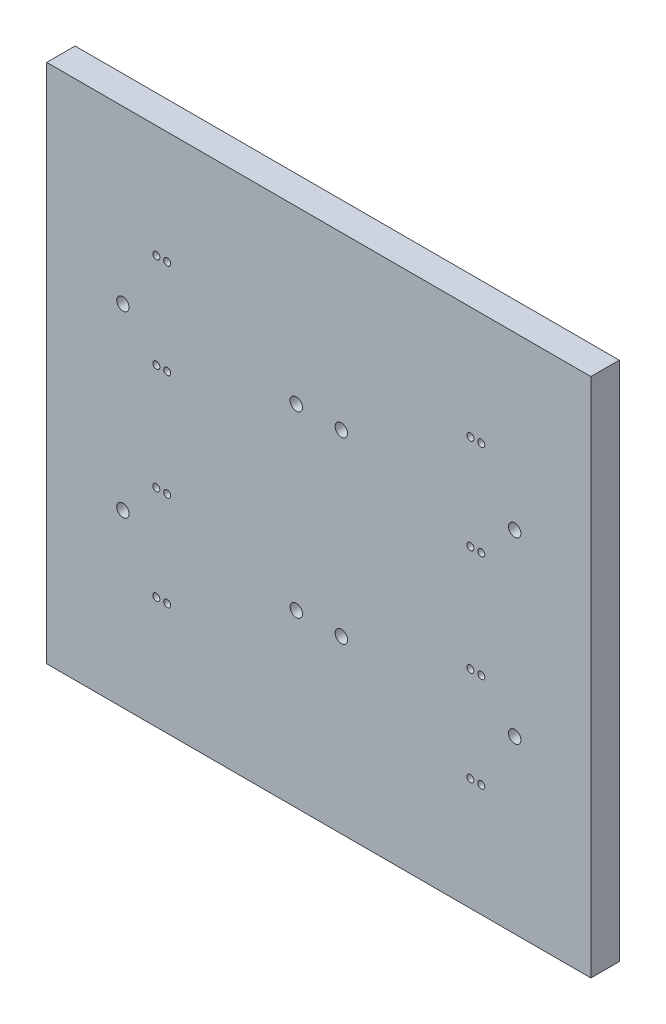
ISO-10303-21;
HEADER;
FILE_DESCRIPTION(('STEP AP214'),'2;1');
FILE_NAME('part.step','',(''),(''),'','','');
FILE_SCHEMA(('AUTOMOTIVE_DESIGN { 1 0 10303 214 1 1 1 1 }'));
ENDSEC;
DATA;
#1=APPLICATION_CONTEXT('core data for automotive mechanical design processes');
#2=APPLICATION_PROTOCOL_DEFINITION('international standard','automotive_design',2000,#1);
#3=PRODUCT_CONTEXT('',#1,'mechanical');
#4=PRODUCT('Part','Part','',(#3));
#5=PRODUCT_RELATED_PRODUCT_CATEGORY('part','',(#4));
#6=PRODUCT_DEFINITION_FORMATION('','',#4);
#7=PRODUCT_DEFINITION_CONTEXT('part definition',#1,'design');
#8=PRODUCT_DEFINITION('design','',#6,#7);
#9=PRODUCT_DEFINITION_SHAPE('','',#8);
#10=(LENGTH_UNIT() NAMED_UNIT(*) SI_UNIT(.MILLI.,.METRE.));
#11=(NAMED_UNIT(*) PLANE_ANGLE_UNIT() SI_UNIT($,.RADIAN.));
#12=(NAMED_UNIT(*) SI_UNIT($,.STERADIAN.) SOLID_ANGLE_UNIT());
#13=UNCERTAINTY_MEASURE_WITH_UNIT(LENGTH_MEASURE(1.E-05),#10,'distance_accuracy_value','');
#14=(GEOMETRIC_REPRESENTATION_CONTEXT(3) GLOBAL_UNCERTAINTY_ASSIGNED_CONTEXT((#13)) GLOBAL_UNIT_ASSIGNED_CONTEXT((#10,
#11,#12)) REPRESENTATION_CONTEXT('',''));
#15=CARTESIAN_POINT('',(0.,0.,0.));
#16=DIRECTION('',(0.,0.,1.));
#17=DIRECTION('',(1.,0.,0.));
#18=AXIS2_PLACEMENT_3D('',#15,#16,#17);
#19=CARTESIAN_POINT('',(70.5,-133.36,18.25));
#20=DIRECTION('',(0.,0.,-1.));
#21=DIRECTION('',(-1.,0.,0.));
#22=AXIS2_PLACEMENT_3D('',#19,#20,#21);
#23=CYLINDRICAL_SURFACE('',#22,2.25);
#24=CARTESIAN_POINT('',(70.5,-133.36,18.25));
#25=DIRECTION('',(0.,0.,-1.));
#26=DIRECTION('',(1.,0.,0.));
#27=AXIS2_PLACEMENT_3D('',#24,#25,#26);
#28=CIRCLE('',#27,2.25);
#29=CARTESIAN_POINT('',(72.75,-133.36,18.25));
#30=VERTEX_POINT('',#29);
#31=EDGE_CURVE('E40',#30,#30,#28,.T.);
#32=ORIENTED_EDGE('',*,*,#31,.F.);
#33=EDGE_LOOP('',(#32));
#34=FACE_BOUND('',#33,.T.);
#35=CARTESIAN_POINT('',(70.5,-133.36,0.));
#36=DIRECTION('',(0.,0.,-1.));
#37=DIRECTION('',(1.,0.,0.));
#38=AXIS2_PLACEMENT_3D('',#35,#36,#37);
#39=CIRCLE('',#38,2.25);
#40=CARTESIAN_POINT('',(72.75,-133.36,0.));
#41=VERTEX_POINT('',#40);
#42=EDGE_CURVE('E11',#41,#41,#39,.T.);
#43=ORIENTED_EDGE('',*,*,#42,.T.);
#44=EDGE_LOOP('',(#43));
#45=FACE_BOUND('',#44,.T.);
#46=ADVANCED_FACE('F32',(#34,#45),#23,.F.);
#47=CARTESIAN_POINT('',(77.5,-133.36,18.25));
#48=DIRECTION('',(0.,0.,-1.));
#49=DIRECTION('',(-1.,0.,0.));
#50=AXIS2_PLACEMENT_3D('',#47,#48,#49);
#51=CYLINDRICAL_SURFACE('',#50,2.25);
#52=CARTESIAN_POINT('',(77.5,-133.36,18.25));
#53=DIRECTION('',(0.,0.,-1.));
#54=DIRECTION('',(1.,0.,0.));
#55=AXIS2_PLACEMENT_3D('',#52,#53,#54);
#56=CIRCLE('',#55,2.25);
#57=CARTESIAN_POINT('',(79.75,-133.36,18.25));
#58=VERTEX_POINT('',#57);
#59=EDGE_CURVE('E206',#58,#58,#56,.T.);
#60=ORIENTED_EDGE('',*,*,#59,.F.);
#61=EDGE_LOOP('',(#60));
#62=FACE_BOUND('',#61,.T.);
#63=CARTESIAN_POINT('',(77.5,-133.36,0.));
#64=DIRECTION('',(0.,0.,-1.));
#65=DIRECTION('',(1.,0.,0.));
#66=AXIS2_PLACEMENT_3D('',#63,#64,#65);
#67=CIRCLE('',#66,2.25);
#68=CARTESIAN_POINT('',(79.75,-133.36,0.));
#69=VERTEX_POINT('',#68);
#70=EDGE_CURVE('E209',#69,#69,#67,.T.);
#71=ORIENTED_EDGE('',*,*,#70,.T.);
#72=EDGE_LOOP('',(#71));
#73=FACE_BOUND('',#72,.T.);
#74=ADVANCED_FACE('F218',(#62,#73),#51,.F.);
#75=CARTESIAN_POINT('',(70.5,-72.36,18.25));
#76=DIRECTION('',(0.,0.,-1.));
#77=DIRECTION('',(-1.,0.,0.));
#78=AXIS2_PLACEMENT_3D('',#75,#76,#77);
#79=CYLINDRICAL_SURFACE('',#78,2.25);
#80=CARTESIAN_POINT('',(70.5,-72.36,18.25));
#81=DIRECTION('',(0.,0.,-1.));
#82=DIRECTION('',(1.,0.,0.));
#83=AXIS2_PLACEMENT_3D('',#80,#81,#82);
#84=CIRCLE('',#83,2.25);
#85=CARTESIAN_POINT('',(72.75,-72.36,18.25));
#86=VERTEX_POINT('',#85);
#87=EDGE_CURVE('E200',#86,#86,#84,.T.);
#88=ORIENTED_EDGE('',*,*,#87,.F.);
#89=EDGE_LOOP('',(#88));
#90=FACE_BOUND('',#89,.T.);
#91=CARTESIAN_POINT('',(70.5,-72.36,0.));
#92=DIRECTION('',(0.,0.,-1.));
#93=DIRECTION('',(1.,0.,0.));
#94=AXIS2_PLACEMENT_3D('',#91,#92,#93);
#95=CIRCLE('',#94,2.25);
#96=CARTESIAN_POINT('',(72.75,-72.36,0.));
#97=VERTEX_POINT('',#96);
#98=EDGE_CURVE('E203',#97,#97,#95,.T.);
#99=ORIENTED_EDGE('',*,*,#98,.T.);
#100=EDGE_LOOP('',(#99));
#101=FACE_BOUND('',#100,.T.);
#102=ADVANCED_FACE('F388',(#90,#101),#79,.F.);
#103=CARTESIAN_POINT('',(77.5,-72.36,18.25));
#104=DIRECTION('',(0.,0.,-1.));
#105=DIRECTION('',(-1.,0.,0.));
#106=AXIS2_PLACEMENT_3D('',#103,#104,#105);
#107=CYLINDRICAL_SURFACE('',#106,2.25);
#108=CARTESIAN_POINT('',(77.5,-72.36,18.25));
#109=DIRECTION('',(0.,0.,-1.));
#110=DIRECTION('',(1.,0.,0.));
#111=AXIS2_PLACEMENT_3D('',#108,#109,#110);
#112=CIRCLE('',#111,2.25);
#113=CARTESIAN_POINT('',(79.75,-72.36,18.25));
#114=VERTEX_POINT('',#113);
#115=EDGE_CURVE('E194',#114,#114,#112,.T.);
#116=ORIENTED_EDGE('',*,*,#115,.F.);
#117=EDGE_LOOP('',(#116));
#118=FACE_BOUND('',#117,.T.);
#119=CARTESIAN_POINT('',(77.5,-72.36,0.));
#120=DIRECTION('',(0.,0.,-1.));
#121=DIRECTION('',(1.,0.,0.));
#122=AXIS2_PLACEMENT_3D('',#119,#120,#121);
#123=CIRCLE('',#122,2.25);
#124=CARTESIAN_POINT('',(79.75,-72.36,0.));
#125=VERTEX_POINT('',#124);
#126=EDGE_CURVE('E197',#125,#125,#123,.T.);
#127=ORIENTED_EDGE('',*,*,#126,.T.);
#128=EDGE_LOOP('',(#127));
#129=FACE_BOUND('',#128,.T.);
#130=ADVANCED_FACE('F384',(#118,#129),#107,.F.);
#131=CARTESIAN_POINT('',(272.5,-133.36,18.25));
#132=DIRECTION('',(0.,0.,-1.));
#133=DIRECTION('',(1.,0.,0.));
#134=AXIS2_PLACEMENT_3D('',#131,#132,#133);
#135=CYLINDRICAL_SURFACE('',#134,2.25);
#136=CARTESIAN_POINT('',(272.5,-133.36,18.25));
#137=DIRECTION('',(0.,0.,1.));
#138=DIRECTION('',(-1.,0.,0.));
#139=AXIS2_PLACEMENT_3D('',#136,#137,#138);
#140=CIRCLE('',#139,2.25);
#141=CARTESIAN_POINT('',(270.25,-133.36,18.25));
#142=VERTEX_POINT('',#141);
#143=EDGE_CURVE('E188',#142,#142,#140,.T.);
#144=ORIENTED_EDGE('',*,*,#143,.T.);
#145=EDGE_LOOP('',(#144));
#146=FACE_BOUND('',#145,.T.);
#147=CARTESIAN_POINT('',(272.5,-133.36,0.));
#148=DIRECTION('',(0.,0.,1.));
#149=DIRECTION('',(-1.,0.,0.));
#150=AXIS2_PLACEMENT_3D('',#147,#148,#149);
#151=CIRCLE('',#150,2.25);
#152=CARTESIAN_POINT('',(270.25,-133.36,0.));
#153=VERTEX_POINT('',#152);
#154=EDGE_CURVE('E191',#153,#153,#151,.T.);
#155=ORIENTED_EDGE('',*,*,#154,.F.);
#156=EDGE_LOOP('',(#155));
#157=FACE_BOUND('',#156,.T.);
#158=ADVANCED_FACE('F380',(#146,#157),#135,.F.);
#159=CARTESIAN_POINT('',(279.5,-133.36,18.25));
#160=DIRECTION('',(0.,0.,-1.));
#161=DIRECTION('',(1.,0.,0.));
#162=AXIS2_PLACEMENT_3D('',#159,#160,#161);
#163=CYLINDRICAL_SURFACE('',#162,2.25);
#164=CARTESIAN_POINT('',(279.5,-133.36,18.25));
#165=DIRECTION('',(0.,0.,1.));
#166=DIRECTION('',(-1.,0.,0.));
#167=AXIS2_PLACEMENT_3D('',#164,#165,#166);
#168=CIRCLE('',#167,2.25);
#169=CARTESIAN_POINT('',(277.25,-133.36,18.25));
#170=VERTEX_POINT('',#169);
#171=EDGE_CURVE('E182',#170,#170,#168,.T.);
#172=ORIENTED_EDGE('',*,*,#171,.T.);
#173=EDGE_LOOP('',(#172));
#174=FACE_BOUND('',#173,.T.);
#175=CARTESIAN_POINT('',(279.5,-133.36,0.));
#176=DIRECTION('',(0.,0.,1.));
#177=DIRECTION('',(-1.,0.,0.));
#178=AXIS2_PLACEMENT_3D('',#175,#176,#177);
#179=CIRCLE('',#178,2.25);
#180=CARTESIAN_POINT('',(277.25,-133.36,0.));
#181=VERTEX_POINT('',#180);
#182=EDGE_CURVE('E185',#181,#181,#179,.T.);
#183=ORIENTED_EDGE('',*,*,#182,.F.);
#184=EDGE_LOOP('',(#183));
#185=FACE_BOUND('',#184,.T.);
#186=ADVANCED_FACE('F376',(#174,#185),#163,.F.);
#187=CARTESIAN_POINT('',(272.5,-72.36,18.25));
#188=DIRECTION('',(0.,0.,-1.));
#189=DIRECTION('',(1.,0.,0.));
#190=AXIS2_PLACEMENT_3D('',#187,#188,#189);
#191=CYLINDRICAL_SURFACE('',#190,2.25);
#192=CARTESIAN_POINT('',(272.5,-72.36,18.25));
#193=DIRECTION('',(0.,0.,1.));
#194=DIRECTION('',(-1.,0.,0.));
#195=AXIS2_PLACEMENT_3D('',#192,#193,#194);
#196=CIRCLE('',#195,2.25);
#197=CARTESIAN_POINT('',(270.25,-72.36,18.25));
#198=VERTEX_POINT('',#197);
#199=EDGE_CURVE('E176',#198,#198,#196,.T.);
#200=ORIENTED_EDGE('',*,*,#199,.T.);
#201=EDGE_LOOP('',(#200));
#202=FACE_BOUND('',#201,.T.);
#203=CARTESIAN_POINT('',(272.5,-72.36,0.));
#204=DIRECTION('',(0.,0.,1.));
#205=DIRECTION('',(-1.,0.,0.));
#206=AXIS2_PLACEMENT_3D('',#203,#204,#205);
#207=CIRCLE('',#206,2.25);
#208=CARTESIAN_POINT('',(270.25,-72.36,0.));
#209=VERTEX_POINT('',#208);
#210=EDGE_CURVE('E179',#209,#209,#207,.T.);
#211=ORIENTED_EDGE('',*,*,#210,.F.);
#212=EDGE_LOOP('',(#211));
#213=FACE_BOUND('',#212,.T.);
#214=ADVANCED_FACE('F372',(#202,#213),#191,.F.);
#215=CARTESIAN_POINT('',(279.5,-72.36,18.25));
#216=DIRECTION('',(0.,0.,-1.));
#217=DIRECTION('',(1.,0.,0.));
#218=AXIS2_PLACEMENT_3D('',#215,#216,#217);
#219=CYLINDRICAL_SURFACE('',#218,2.25);
#220=CARTESIAN_POINT('',(279.5,-72.36,18.25));
#221=DIRECTION('',(0.,0.,1.));
#222=DIRECTION('',(-1.,0.,0.));
#223=AXIS2_PLACEMENT_3D('',#220,#221,#222);
#224=CIRCLE('',#223,2.25);
#225=CARTESIAN_POINT('',(277.25,-72.36,18.25));
#226=VERTEX_POINT('',#225);
#227=EDGE_CURVE('E170',#226,#226,#224,.T.);
#228=ORIENTED_EDGE('',*,*,#227,.T.);
#229=EDGE_LOOP('',(#228));
#230=FACE_BOUND('',#229,.T.);
#231=CARTESIAN_POINT('',(279.5,-72.36,0.));
#232=DIRECTION('',(0.,0.,1.));
#233=DIRECTION('',(-1.,0.,0.));
#234=AXIS2_PLACEMENT_3D('',#231,#232,#233);
#235=CIRCLE('',#234,2.25);
#236=CARTESIAN_POINT('',(277.25,-72.36,0.));
#237=VERTEX_POINT('',#236);
#238=EDGE_CURVE('E173',#237,#237,#235,.T.);
#239=ORIENTED_EDGE('',*,*,#238,.F.);
#240=EDGE_LOOP('',(#239));
#241=FACE_BOUND('',#240,.T.);
#242=ADVANCED_FACE('F368',(#230,#241),#219,.F.);
#243=CARTESIAN_POINT('',(49.,-110.,18.25));
#244=DIRECTION('',(0.,0.,-1.));
#245=DIRECTION('',(-1.,0.,0.));
#246=AXIS2_PLACEMENT_3D('',#243,#244,#245);
#247=CYLINDRICAL_SURFACE('',#246,4.00000000000001);
#248=CARTESIAN_POINT('',(49.,-110.,18.25));
#249=DIRECTION('',(0.,0.,-1.));
#250=DIRECTION('',(1.,0.,0.));
#251=AXIS2_PLACEMENT_3D('',#248,#249,#250);
#252=CIRCLE('',#251,4.00000000000001);
#253=CARTESIAN_POINT('',(53.,-110.,18.25));
#254=VERTEX_POINT('',#253);
#255=EDGE_CURVE('E164',#254,#254,#252,.T.);
#256=ORIENTED_EDGE('',*,*,#255,.F.);
#257=EDGE_LOOP('',(#256));
#258=FACE_BOUND('',#257,.T.);
#259=CARTESIAN_POINT('',(49.,-110.,0.));
#260=DIRECTION('',(0.,0.,-1.));
#261=DIRECTION('',(1.,0.,0.));
#262=AXIS2_PLACEMENT_3D('',#259,#260,#261);
#263=CIRCLE('',#262,4.00000000000001);
#264=CARTESIAN_POINT('',(53.,-110.,0.));
#265=VERTEX_POINT('',#264);
#266=EDGE_CURVE('E167',#265,#265,#263,.T.);
#267=ORIENTED_EDGE('',*,*,#266,.T.);
#268=EDGE_LOOP('',(#267));
#269=FACE_BOUND('',#268,.T.);
#270=ADVANCED_FACE('F364',(#258,#269),#247,.F.);
#271=CARTESIAN_POINT('',(301.,-110.,18.25));
#272=DIRECTION('',(0.,0.,-1.));
#273=DIRECTION('',(1.,0.,0.));
#274=AXIS2_PLACEMENT_3D('',#271,#272,#273);
#275=CYLINDRICAL_SURFACE('',#274,4.00000000000001);
#276=CARTESIAN_POINT('',(301.,-110.,18.25));
#277=DIRECTION('',(0.,0.,1.));
#278=DIRECTION('',(-1.,0.,0.));
#279=AXIS2_PLACEMENT_3D('',#276,#277,#278);
#280=CIRCLE('',#279,4.00000000000001);
#281=CARTESIAN_POINT('',(297.,-110.,18.25));
#282=VERTEX_POINT('',#281);
#283=EDGE_CURVE('E158',#282,#282,#280,.T.);
#284=ORIENTED_EDGE('',*,*,#283,.T.);
#285=EDGE_LOOP('',(#284));
#286=FACE_BOUND('',#285,.T.);
#287=CARTESIAN_POINT('',(301.,-110.,0.));
#288=DIRECTION('',(0.,0.,1.));
#289=DIRECTION('',(-1.,0.,0.));
#290=AXIS2_PLACEMENT_3D('',#287,#288,#289);
#291=CIRCLE('',#290,4.00000000000001);
#292=CARTESIAN_POINT('',(297.,-110.,0.));
#293=VERTEX_POINT('',#292);
#294=EDGE_CURVE('E161',#293,#293,#291,.T.);
#295=ORIENTED_EDGE('',*,*,#294,.F.);
#296=EDGE_LOOP('',(#295));
#297=FACE_BOUND('',#296,.T.);
#298=ADVANCED_FACE('F360',(#286,#297),#275,.F.);
#299=CARTESIAN_POINT('',(189.5,-110.,18.25));
#300=DIRECTION('',(0.,0.,-1.));
#301=DIRECTION('',(1.,0.,0.));
#302=AXIS2_PLACEMENT_3D('',#299,#300,#301);
#303=CYLINDRICAL_SURFACE('',#302,3.99999999999999);
#304=CARTESIAN_POINT('',(189.5,-110.,18.25));
#305=DIRECTION('',(0.,0.,1.));
#306=DIRECTION('',(-1.,0.,0.));
#307=AXIS2_PLACEMENT_3D('',#304,#305,#306);
#308=CIRCLE('',#307,3.99999999999999);
#309=CARTESIAN_POINT('',(185.5,-110.,18.25));
#310=VERTEX_POINT('',#309);
#311=EDGE_CURVE('E152',#310,#310,#308,.T.);
#312=ORIENTED_EDGE('',*,*,#311,.T.);
#313=EDGE_LOOP('',(#312));
#314=FACE_BOUND('',#313,.T.);
#315=CARTESIAN_POINT('',(189.5,-110.,0.));
#316=DIRECTION('',(0.,0.,1.));
#317=DIRECTION('',(-1.,0.,0.));
#318=AXIS2_PLACEMENT_3D('',#315,#316,#317);
#319=CIRCLE('',#318,3.99999999999999);
#320=CARTESIAN_POINT('',(185.5,-110.,0.));
#321=VERTEX_POINT('',#320);
#322=EDGE_CURVE('E155',#321,#321,#319,.T.);
#323=ORIENTED_EDGE('',*,*,#322,.F.);
#324=EDGE_LOOP('',(#323));
#325=FACE_BOUND('',#324,.T.);
#326=ADVANCED_FACE('F356',(#314,#325),#303,.F.);
#327=CARTESIAN_POINT('',(160.5,-110.,18.25));
#328=DIRECTION('',(0.,0.,-1.));
#329=DIRECTION('',(-1.,0.,0.));
#330=AXIS2_PLACEMENT_3D('',#327,#328,#329);
#331=CYLINDRICAL_SURFACE('',#330,3.99999999999999);
#332=CARTESIAN_POINT('',(160.5,-110.,18.25));
#333=DIRECTION('',(0.,0.,-1.));
#334=DIRECTION('',(1.,0.,0.));
#335=AXIS2_PLACEMENT_3D('',#332,#333,#334);
#336=CIRCLE('',#335,3.99999999999999);
#337=CARTESIAN_POINT('',(164.5,-110.,18.25));
#338=VERTEX_POINT('',#337);
#339=EDGE_CURVE('E146',#338,#338,#336,.T.);
#340=ORIENTED_EDGE('',*,*,#339,.F.);
#341=EDGE_LOOP('',(#340));
#342=FACE_BOUND('',#341,.T.);
#343=CARTESIAN_POINT('',(160.5,-110.,0.));
#344=DIRECTION('',(0.,0.,-1.));
#345=DIRECTION('',(1.,0.,0.));
#346=AXIS2_PLACEMENT_3D('',#343,#344,#345);
#347=CIRCLE('',#346,3.99999999999999);
#348=CARTESIAN_POINT('',(164.5,-110.,0.));
#349=VERTEX_POINT('',#348);
#350=EDGE_CURVE('E149',#349,#349,#347,.T.);
#351=ORIENTED_EDGE('',*,*,#350,.T.);
#352=EDGE_LOOP('',(#351));
#353=FACE_BOUND('',#352,.T.);
#354=ADVANCED_FACE('F352',(#342,#353),#331,.F.);
#355=CARTESIAN_POINT('',(279.5,-201.64,18.25));
#356=DIRECTION('',(0.,0.,-1.));
#357=DIRECTION('',(1.,0.,0.));
#358=AXIS2_PLACEMENT_3D('',#355,#356,#357);
#359=CYLINDRICAL_SURFACE('',#358,2.25);
#360=CARTESIAN_POINT('',(279.5,-201.64,18.25));
#361=DIRECTION('',(0.,0.,-1.));
#362=DIRECTION('',(-1.,0.,0.));
#363=AXIS2_PLACEMENT_3D('',#360,#361,#362);
#364=CIRCLE('',#363,2.25);
#365=CARTESIAN_POINT('',(277.25,-201.64,18.25));
#366=VERTEX_POINT('',#365);
#367=EDGE_CURVE('E140',#366,#366,#364,.T.);
#368=ORIENTED_EDGE('',*,*,#367,.F.);
#369=EDGE_LOOP('',(#368));
#370=FACE_BOUND('',#369,.T.);
#371=CARTESIAN_POINT('',(279.5,-201.64,0.));
#372=DIRECTION('',(0.,0.,-1.));
#373=DIRECTION('',(-1.,0.,0.));
#374=AXIS2_PLACEMENT_3D('',#371,#372,#373);
#375=CIRCLE('',#374,2.25);
#376=CARTESIAN_POINT('',(277.25,-201.64,0.));
#377=VERTEX_POINT('',#376);
#378=EDGE_CURVE('E143',#377,#377,#375,.T.);
#379=ORIENTED_EDGE('',*,*,#378,.T.);
#380=EDGE_LOOP('',(#379));
#381=FACE_BOUND('',#380,.T.);
#382=ADVANCED_FACE('F348',(#370,#381),#359,.F.);
#383=CARTESIAN_POINT('',(272.5,-201.64,18.25));
#384=DIRECTION('',(0.,0.,-1.));
#385=DIRECTION('',(1.,0.,0.));
#386=AXIS2_PLACEMENT_3D('',#383,#384,#385);
#387=CYLINDRICAL_SURFACE('',#386,2.25);
#388=CARTESIAN_POINT('',(272.5,-201.64,18.25));
#389=DIRECTION('',(0.,0.,-1.));
#390=DIRECTION('',(-1.,0.,0.));
#391=AXIS2_PLACEMENT_3D('',#388,#389,#390);
#392=CIRCLE('',#391,2.25);
#393=CARTESIAN_POINT('',(270.25,-201.64,18.25));
#394=VERTEX_POINT('',#393);
#395=EDGE_CURVE('E134',#394,#394,#392,.T.);
#396=ORIENTED_EDGE('',*,*,#395,.F.);
#397=EDGE_LOOP('',(#396));
#398=FACE_BOUND('',#397,.T.);
#399=CARTESIAN_POINT('',(272.5,-201.64,0.));
#400=DIRECTION('',(0.,0.,-1.));
#401=DIRECTION('',(-1.,0.,0.));
#402=AXIS2_PLACEMENT_3D('',#399,#400,#401);
#403=CIRCLE('',#402,2.25);
#404=CARTESIAN_POINT('',(270.25,-201.64,0.));
#405=VERTEX_POINT('',#404);
#406=EDGE_CURVE('E137',#405,#405,#403,.T.);
#407=ORIENTED_EDGE('',*,*,#406,.T.);
#408=EDGE_LOOP('',(#407));
#409=FACE_BOUND('',#408,.T.);
#410=ADVANCED_FACE('F344',(#398,#409),#387,.F.);
#411=CARTESIAN_POINT('',(272.5,-262.64,18.25));
#412=DIRECTION('',(0.,0.,-1.));
#413=DIRECTION('',(1.,0.,0.));
#414=AXIS2_PLACEMENT_3D('',#411,#412,#413);
#415=CYLINDRICAL_SURFACE('',#414,2.25);
#416=CARTESIAN_POINT('',(272.5,-262.64,18.25));
#417=DIRECTION('',(0.,0.,-1.));
#418=DIRECTION('',(-1.,0.,0.));
#419=AXIS2_PLACEMENT_3D('',#416,#417,#418);
#420=CIRCLE('',#419,2.25);
#421=CARTESIAN_POINT('',(270.25,-262.64,18.25));
#422=VERTEX_POINT('',#421);
#423=EDGE_CURVE('E128',#422,#422,#420,.T.);
#424=ORIENTED_EDGE('',*,*,#423,.F.);
#425=EDGE_LOOP('',(#424));
#426=FACE_BOUND('',#425,.T.);
#427=CARTESIAN_POINT('',(272.5,-262.64,0.));
#428=DIRECTION('',(0.,0.,-1.));
#429=DIRECTION('',(-1.,0.,0.));
#430=AXIS2_PLACEMENT_3D('',#427,#428,#429);
#431=CIRCLE('',#430,2.25);
#432=CARTESIAN_POINT('',(270.25,-262.64,0.));
#433=VERTEX_POINT('',#432);
#434=EDGE_CURVE('E131',#433,#433,#431,.T.);
#435=ORIENTED_EDGE('',*,*,#434,.T.);
#436=EDGE_LOOP('',(#435));
#437=FACE_BOUND('',#436,.T.);
#438=ADVANCED_FACE('F340',(#426,#437),#415,.F.);
#439=CARTESIAN_POINT('',(279.5,-262.64,18.25));
#440=DIRECTION('',(0.,0.,-1.));
#441=DIRECTION('',(1.,0.,0.));
#442=AXIS2_PLACEMENT_3D('',#439,#440,#441);
#443=CYLINDRICAL_SURFACE('',#442,2.25);
#444=CARTESIAN_POINT('',(279.5,-262.64,18.25));
#445=DIRECTION('',(0.,0.,-1.));
#446=DIRECTION('',(-1.,0.,0.));
#447=AXIS2_PLACEMENT_3D('',#444,#445,#446);
#448=CIRCLE('',#447,2.25);
#449=CARTESIAN_POINT('',(277.25,-262.64,18.25));
#450=VERTEX_POINT('',#449);
#451=EDGE_CURVE('E122',#450,#450,#448,.T.);
#452=ORIENTED_EDGE('',*,*,#451,.F.);
#453=EDGE_LOOP('',(#452));
#454=FACE_BOUND('',#453,.T.);
#455=CARTESIAN_POINT('',(279.5,-262.64,0.));
#456=DIRECTION('',(0.,0.,-1.));
#457=DIRECTION('',(-1.,0.,0.));
#458=AXIS2_PLACEMENT_3D('',#455,#456,#457);
#459=CIRCLE('',#458,2.25);
#460=CARTESIAN_POINT('',(277.25,-262.64,0.));
#461=VERTEX_POINT('',#460);
#462=EDGE_CURVE('E125',#461,#461,#459,.T.);
#463=ORIENTED_EDGE('',*,*,#462,.T.);
#464=EDGE_LOOP('',(#463));
#465=FACE_BOUND('',#464,.T.);
#466=ADVANCED_FACE('F336',(#454,#465),#443,.F.);
#467=CARTESIAN_POINT('',(301.,-225.,18.25));
#468=DIRECTION('',(0.,0.,-1.));
#469=DIRECTION('',(1.,0.,0.));
#470=AXIS2_PLACEMENT_3D('',#467,#468,#469);
#471=CYLINDRICAL_SURFACE('',#470,4.00000000000001);
#472=CARTESIAN_POINT('',(301.,-225.,18.25));
#473=DIRECTION('',(0.,0.,-1.));
#474=DIRECTION('',(-1.,0.,0.));
#475=AXIS2_PLACEMENT_3D('',#472,#473,#474);
#476=CIRCLE('',#475,4.00000000000001);
#477=CARTESIAN_POINT('',(297.,-225.,18.25));
#478=VERTEX_POINT('',#477);
#479=EDGE_CURVE('E116',#478,#478,#476,.T.);
#480=ORIENTED_EDGE('',*,*,#479,.F.);
#481=EDGE_LOOP('',(#480));
#482=FACE_BOUND('',#481,.T.);
#483=CARTESIAN_POINT('',(301.,-225.,0.));
#484=DIRECTION('',(0.,0.,-1.));
#485=DIRECTION('',(-1.,0.,0.));
#486=AXIS2_PLACEMENT_3D('',#483,#484,#485);
#487=CIRCLE('',#486,4.00000000000001);
#488=CARTESIAN_POINT('',(297.,-225.,0.));
#489=VERTEX_POINT('',#488);
#490=EDGE_CURVE('E119',#489,#489,#487,.T.);
#491=ORIENTED_EDGE('',*,*,#490,.T.);
#492=EDGE_LOOP('',(#491));
#493=FACE_BOUND('',#492,.T.);
#494=ADVANCED_FACE('F318',(#482,#493),#471,.F.);
#495=CARTESIAN_POINT('',(189.5,-225.,18.25));
#496=DIRECTION('',(0.,0.,-1.));
#497=DIRECTION('',(1.,0.,0.));
#498=AXIS2_PLACEMENT_3D('',#495,#496,#497);
#499=CYLINDRICAL_SURFACE('',#498,3.99999999999999);
#500=CARTESIAN_POINT('',(189.5,-225.,18.25));
#501=DIRECTION('',(0.,0.,-1.));
#502=DIRECTION('',(-1.,0.,0.));
#503=AXIS2_PLACEMENT_3D('',#500,#501,#502);
#504=CIRCLE('',#503,3.99999999999999);
#505=CARTESIAN_POINT('',(185.5,-225.,18.25));
#506=VERTEX_POINT('',#505);
#507=EDGE_CURVE('E110',#506,#506,#504,.T.);
#508=ORIENTED_EDGE('',*,*,#507,.F.);
#509=EDGE_LOOP('',(#508));
#510=FACE_BOUND('',#509,.T.);
#511=CARTESIAN_POINT('',(189.5,-225.,0.));
#512=DIRECTION('',(0.,0.,-1.));
#513=DIRECTION('',(-1.,0.,0.));
#514=AXIS2_PLACEMENT_3D('',#511,#512,#513);
#515=CIRCLE('',#514,3.99999999999999);
#516=CARTESIAN_POINT('',(185.5,-225.,0.));
#517=VERTEX_POINT('',#516);
#518=EDGE_CURVE('E113',#517,#517,#515,.T.);
#519=ORIENTED_EDGE('',*,*,#518,.T.);
#520=EDGE_LOOP('',(#519));
#521=FACE_BOUND('',#520,.T.);
#522=ADVANCED_FACE('F312',(#510,#521),#499,.F.);
#523=CARTESIAN_POINT('',(0.,0.,18.25));
#524=DIRECTION('',(0.,0.,1.));
#525=DIRECTION('',(1.,0.,0.));
#526=AXIS2_PLACEMENT_3D('',#523,#524,#525);
#527=PLANE('',#526);
#528=ORIENTED_EDGE('',*,*,#255,.T.);
#529=EDGE_LOOP('',(#528));
#530=FACE_BOUND('',#529,.T.);
#531=ORIENTED_EDGE('',*,*,#31,.T.);
#532=EDGE_LOOP('',(#531));
#533=FACE_BOUND('',#532,.T.);
#534=ORIENTED_EDGE('',*,*,#115,.T.);
#535=EDGE_LOOP('',(#534));
#536=FACE_BOUND('',#535,.T.);
#537=ORIENTED_EDGE('',*,*,#87,.T.);
#538=EDGE_LOOP('',(#537));
#539=FACE_BOUND('',#538,.T.);
#540=ORIENTED_EDGE('',*,*,#59,.T.);
#541=EDGE_LOOP('',(#540));
#542=FACE_BOUND('',#541,.T.);
#543=ORIENTED_EDGE('',*,*,#339,.T.);
#544=EDGE_LOOP('',(#543));
#545=FACE_BOUND('',#544,.T.);
#546=ORIENTED_EDGE('',*,*,#311,.F.);
#547=EDGE_LOOP('',(#546));
#548=FACE_BOUND('',#547,.T.);
#549=ORIENTED_EDGE('',*,*,#143,.F.);
#550=EDGE_LOOP('',(#549));
#551=FACE_BOUND('',#550,.T.);
#552=ORIENTED_EDGE('',*,*,#227,.F.);
#553=EDGE_LOOP('',(#552));
#554=FACE_BOUND('',#553,.T.);
#555=ORIENTED_EDGE('',*,*,#199,.F.);
#556=EDGE_LOOP('',(#555));
#557=FACE_BOUND('',#556,.T.);
#558=ORIENTED_EDGE('',*,*,#171,.F.);
#559=EDGE_LOOP('',(#558));
#560=FACE_BOUND('',#559,.T.);
#561=ORIENTED_EDGE('',*,*,#283,.F.);
#562=EDGE_LOOP('',(#561));
#563=FACE_BOUND('',#562,.T.);
#564=ORIENTED_EDGE('',*,*,#479,.T.);
#565=EDGE_LOOP('',(#564));
#566=FACE_BOUND('',#565,.T.);
#567=ORIENTED_EDGE('',*,*,#367,.T.);
#568=EDGE_LOOP('',(#567));
#569=FACE_BOUND('',#568,.T.);
#570=ORIENTED_EDGE('',*,*,#423,.T.);
#571=EDGE_LOOP('',(#570));
#572=FACE_BOUND('',#571,.T.);
#573=ORIENTED_EDGE('',*,*,#451,.T.);
#574=EDGE_LOOP('',(#573));
#575=FACE_BOUND('',#574,.T.);
#576=ORIENTED_EDGE('',*,*,#395,.T.);
#577=EDGE_LOOP('',(#576));
#578=FACE_BOUND('',#577,.T.);
#579=ORIENTED_EDGE('',*,*,#507,.T.);
#580=EDGE_LOOP('',(#579));
#581=FACE_BOUND('',#580,.T.);
#582=CARTESIAN_POINT('',(160.5,-225.,18.25));
#583=DIRECTION('',(0.,0.,1.));
#584=DIRECTION('',(1.,0.,0.));
#585=AXIS2_PLACEMENT_3D('',#582,#583,#584);
#586=CIRCLE('',#585,3.99999999999999);
#587=CARTESIAN_POINT('',(164.5,-225.,18.25));
#588=VERTEX_POINT('',#587);
#589=EDGE_CURVE('E288',#588,#588,#586,.T.);
#590=ORIENTED_EDGE('',*,*,#589,.F.);
#591=EDGE_LOOP('',(#590));
#592=FACE_BOUND('',#591,.T.);
#593=CARTESIAN_POINT('',(77.5,-201.64,18.25));
#594=DIRECTION('',(0.,0.,1.));
#595=DIRECTION('',(1.,0.,0.));
#596=AXIS2_PLACEMENT_3D('',#593,#594,#595);
#597=CIRCLE('',#596,2.25);
#598=CARTESIAN_POINT('',(79.75,-201.64,18.25));
#599=VERTEX_POINT('',#598);
#600=EDGE_CURVE('E296',#599,#599,#597,.T.);
#601=ORIENTED_EDGE('',*,*,#600,.F.);
#602=EDGE_LOOP('',(#601));
#603=FACE_BOUND('',#602,.T.);
#604=CARTESIAN_POINT('',(70.5,-262.64,18.25));
#605=DIRECTION('',(0.,0.,1.));
#606=DIRECTION('',(1.,0.,0.));
#607=AXIS2_PLACEMENT_3D('',#604,#605,#606);
#608=CIRCLE('',#607,2.25);
#609=CARTESIAN_POINT('',(72.75,-262.64,18.25));
#610=VERTEX_POINT('',#609);
#611=EDGE_CURVE('E103',#610,#610,#608,.T.);
#612=ORIENTED_EDGE('',*,*,#611,.F.);
#613=EDGE_LOOP('',(#612));
#614=FACE_BOUND('',#613,.T.);
#615=DIRECTION('',(0.,-1.,0.));
#616=VECTOR('',#615,1.);
#617=CARTESIAN_POINT('',(0.,0.,18.25));
#618=LINE('',#617,#616);
#619=CARTESIAN_POINT('',(0.,0.,18.25));
#620=VERTEX_POINT('',#619);
#621=CARTESIAN_POINT('',(0.,-335.,18.25));
#622=VERTEX_POINT('',#621);
#623=EDGE_CURVE('E85',#620,#622,#618,.T.);
#624=ORIENTED_EDGE('',*,*,#623,.T.);
#625=DIRECTION('',(1.,0.,0.));
#626=VECTOR('',#625,1.);
#627=CARTESIAN_POINT('',(0.,-335.,18.25));
#628=LINE('',#627,#626);
#629=CARTESIAN_POINT('',(350.,-335.,18.25));
#630=VERTEX_POINT('',#629);
#631=EDGE_CURVE('E79',#622,#630,#628,.T.);
#632=ORIENTED_EDGE('',*,*,#631,.T.);
#633=DIRECTION('',(0.,1.,0.));
#634=VECTOR('',#633,1.);
#635=CARTESIAN_POINT('',(350.,0.,18.25));
#636=LINE('',#635,#634);
#637=CARTESIAN_POINT('',(350.,0.,18.25));
#638=VERTEX_POINT('',#637);
#639=EDGE_CURVE('E83',#630,#638,#636,.T.);
#640=ORIENTED_EDGE('',*,*,#639,.T.);
#641=DIRECTION('',(-1.,0.,0.));
#642=VECTOR('',#641,1.);
#643=CARTESIAN_POINT('',(0.,0.,18.25));
#644=LINE('',#643,#642);
#645=EDGE_CURVE('E48',#638,#620,#644,.T.);
#646=ORIENTED_EDGE('',*,*,#645,.T.);
#647=EDGE_LOOP('',(#624,#632,#640,#646));
#648=FACE_BOUND('',#647,.T.);
#649=CARTESIAN_POINT('',(77.5,-262.64,18.25));
#650=DIRECTION('',(0.,0.,1.));
#651=DIRECTION('',(1.,0.,0.));
#652=AXIS2_PLACEMENT_3D('',#649,#650,#651);
#653=CIRCLE('',#652,2.25);
#654=CARTESIAN_POINT('',(79.75,-262.64,18.25));
#655=VERTEX_POINT('',#654);
#656=EDGE_CURVE('E300',#655,#655,#653,.T.);
#657=ORIENTED_EDGE('',*,*,#656,.F.);
#658=EDGE_LOOP('',(#657));
#659=FACE_BOUND('',#658,.T.);
#660=CARTESIAN_POINT('',(70.5,-201.64,18.25));
#661=DIRECTION('',(0.,0.,1.));
#662=DIRECTION('',(1.,0.,0.));
#663=AXIS2_PLACEMENT_3D('',#660,#661,#662);
#664=CIRCLE('',#663,2.25);
#665=CARTESIAN_POINT('',(72.75,-201.64,18.25));
#666=VERTEX_POINT('',#665);
#667=EDGE_CURVE('E292',#666,#666,#664,.T.);
#668=ORIENTED_EDGE('',*,*,#667,.F.);
#669=EDGE_LOOP('',(#668));
#670=FACE_BOUND('',#669,.T.);
#671=CARTESIAN_POINT('',(49.,-225.,18.25));
#672=DIRECTION('',(0.,0.,1.));
#673=DIRECTION('',(1.,0.,0.));
#674=AXIS2_PLACEMENT_3D('',#671,#672,#673);
#675=CIRCLE('',#674,4.00000000000001);
#676=CARTESIAN_POINT('',(53.,-225.,18.25));
#677=VERTEX_POINT('',#676);
#678=EDGE_CURVE('E283',#677,#677,#675,.T.);
#679=ORIENTED_EDGE('',*,*,#678,.F.);
#680=EDGE_LOOP('',(#679));
#681=FACE_BOUND('',#680,.T.);
#682=ADVANCED_FACE('F80',(#530,#533,#536,#539,#542,#545,#548,#551,#554,#557,#560,#563,#566,#569,
#572,#575,#578,#581,#592,#603,#614,#648,#659,#670,#681),#527,.T.);
#683=CARTESIAN_POINT('',(0.,0.,0.));
#684=DIRECTION('',(0.,0.,1.));
#685=DIRECTION('',(1.,0.,0.));
#686=AXIS2_PLACEMENT_3D('',#683,#684,#685);
#687=PLANE('',#686);
#688=ORIENTED_EDGE('',*,*,#266,.F.);
#689=EDGE_LOOP('',(#688));
#690=FACE_BOUND('',#689,.T.);
#691=ORIENTED_EDGE('',*,*,#350,.F.);
#692=EDGE_LOOP('',(#691));
#693=FACE_BOUND('',#692,.T.);
#694=ORIENTED_EDGE('',*,*,#42,.F.);
#695=EDGE_LOOP('',(#694));
#696=FACE_BOUND('',#695,.T.);
#697=ORIENTED_EDGE('',*,*,#70,.F.);
#698=EDGE_LOOP('',(#697));
#699=FACE_BOUND('',#698,.T.);
#700=ORIENTED_EDGE('',*,*,#126,.F.);
#701=EDGE_LOOP('',(#700));
#702=FACE_BOUND('',#701,.T.);
#703=ORIENTED_EDGE('',*,*,#98,.F.);
#704=EDGE_LOOP('',(#703));
#705=FACE_BOUND('',#704,.T.);
#706=ORIENTED_EDGE('',*,*,#238,.T.);
#707=EDGE_LOOP('',(#706));
#708=FACE_BOUND('',#707,.T.);
#709=ORIENTED_EDGE('',*,*,#210,.T.);
#710=EDGE_LOOP('',(#709));
#711=FACE_BOUND('',#710,.T.);
#712=ORIENTED_EDGE('',*,*,#154,.T.);
#713=EDGE_LOOP('',(#712));
#714=FACE_BOUND('',#713,.T.);
#715=ORIENTED_EDGE('',*,*,#182,.T.);
#716=EDGE_LOOP('',(#715));
#717=FACE_BOUND('',#716,.T.);
#718=ORIENTED_EDGE('',*,*,#322,.T.);
#719=EDGE_LOOP('',(#718));
#720=FACE_BOUND('',#719,.T.);
#721=ORIENTED_EDGE('',*,*,#294,.T.);
#722=EDGE_LOOP('',(#721));
#723=FACE_BOUND('',#722,.T.);
#724=ORIENTED_EDGE('',*,*,#490,.F.);
#725=EDGE_LOOP('',(#724));
#726=FACE_BOUND('',#725,.T.);
#727=ORIENTED_EDGE('',*,*,#518,.F.);
#728=EDGE_LOOP('',(#727));
#729=FACE_BOUND('',#728,.T.);
#730=ORIENTED_EDGE('',*,*,#378,.F.);
#731=EDGE_LOOP('',(#730));
#732=FACE_BOUND('',#731,.T.);
#733=ORIENTED_EDGE('',*,*,#406,.F.);
#734=EDGE_LOOP('',(#733));
#735=FACE_BOUND('',#734,.T.);
#736=ORIENTED_EDGE('',*,*,#434,.F.);
#737=EDGE_LOOP('',(#736));
#738=FACE_BOUND('',#737,.T.);
#739=ORIENTED_EDGE('',*,*,#462,.F.);
#740=EDGE_LOOP('',(#739));
#741=FACE_BOUND('',#740,.T.);
#742=DIRECTION('',(0.,-1.,0.));
#743=VECTOR('',#742,1.);
#744=CARTESIAN_POINT('',(0.,0.,0.));
#745=LINE('',#744,#743);
#746=CARTESIAN_POINT('',(0.,0.,0.));
#747=VERTEX_POINT('',#746);
#748=CARTESIAN_POINT('',(0.,-335.,0.));
#749=VERTEX_POINT('',#748);
#750=EDGE_CURVE('E100',#747,#749,#745,.T.);
#751=ORIENTED_EDGE('',*,*,#750,.F.);
#752=DIRECTION('',(-1.,0.,0.));
#753=VECTOR('',#752,1.);
#754=CARTESIAN_POINT('',(0.,0.,0.));
#755=LINE('',#754,#753);
#756=CARTESIAN_POINT('',(350.,0.,0.));
#757=VERTEX_POINT('',#756);
#758=EDGE_CURVE('E71',#757,#747,#755,.T.);
#759=ORIENTED_EDGE('',*,*,#758,.F.);
#760=DIRECTION('',(0.,1.,0.));
#761=VECTOR('',#760,1.);
#762=CARTESIAN_POINT('',(350.,0.,0.));
#763=LINE('',#762,#761);
#764=CARTESIAN_POINT('',(350.,-335.,0.));
#765=VERTEX_POINT('',#764);
#766=EDGE_CURVE('E65',#765,#757,#763,.T.);
#767=ORIENTED_EDGE('',*,*,#766,.F.);
#768=DIRECTION('',(1.,0.,0.));
#769=VECTOR('',#768,1.);
#770=CARTESIAN_POINT('',(0.,-335.,0.));
#771=LINE('',#770,#769);
#772=EDGE_CURVE('E90',#749,#765,#771,.T.);
#773=ORIENTED_EDGE('',*,*,#772,.F.);
#774=EDGE_LOOP('',(#751,#759,#767,#773));
#775=FACE_BOUND('',#774,.T.);
#776=CARTESIAN_POINT('',(70.5,-262.64,0.));
#777=DIRECTION('',(0.,0.,1.));
#778=DIRECTION('',(1.,0.,0.));
#779=AXIS2_PLACEMENT_3D('',#776,#777,#778);
#780=CIRCLE('',#779,2.25);
#781=CARTESIAN_POINT('',(72.75,-262.64,0.));
#782=VERTEX_POINT('',#781);
#783=EDGE_CURVE('E262',#782,#782,#780,.T.);
#784=ORIENTED_EDGE('',*,*,#783,.T.);
#785=EDGE_LOOP('',(#784));
#786=FACE_BOUND('',#785,.T.);
#787=CARTESIAN_POINT('',(77.5,-262.64,0.));
#788=DIRECTION('',(0.,0.,1.));
#789=DIRECTION('',(1.,0.,0.));
#790=AXIS2_PLACEMENT_3D('',#787,#788,#789);
#791=CIRCLE('',#790,2.25);
#792=CARTESIAN_POINT('',(79.75,-262.64,0.));
#793=VERTEX_POINT('',#792);
#794=EDGE_CURVE('E266',#793,#793,#791,.T.);
#795=ORIENTED_EDGE('',*,*,#794,.T.);
#796=EDGE_LOOP('',(#795));
#797=FACE_BOUND('',#796,.T.);
#798=CARTESIAN_POINT('',(77.5,-201.64,0.));
#799=DIRECTION('',(0.,0.,1.));
#800=DIRECTION('',(1.,0.,0.));
#801=AXIS2_PLACEMENT_3D('',#798,#799,#800);
#802=CIRCLE('',#801,2.25);
#803=CARTESIAN_POINT('',(79.75,-201.64,0.));
#804=VERTEX_POINT('',#803);
#805=EDGE_CURVE('E270',#804,#804,#802,.T.);
#806=ORIENTED_EDGE('',*,*,#805,.T.);
#807=EDGE_LOOP('',(#806));
#808=FACE_BOUND('',#807,.T.);
#809=CARTESIAN_POINT('',(70.5,-201.64,0.));
#810=DIRECTION('',(0.,0.,1.));
#811=DIRECTION('',(1.,0.,0.));
#812=AXIS2_PLACEMENT_3D('',#809,#810,#811);
#813=CIRCLE('',#812,2.25);
#814=CARTESIAN_POINT('',(72.75,-201.64,0.));
#815=VERTEX_POINT('',#814);
#816=EDGE_CURVE('E274',#815,#815,#813,.T.);
#817=ORIENTED_EDGE('',*,*,#816,.T.);
#818=EDGE_LOOP('',(#817));
#819=FACE_BOUND('',#818,.T.);
#820=CARTESIAN_POINT('',(160.5,-225.,0.));
#821=DIRECTION('',(0.,0.,1.));
#822=DIRECTION('',(1.,0.,0.));
#823=AXIS2_PLACEMENT_3D('',#820,#821,#822);
#824=CIRCLE('',#823,3.99999999999999);
#825=CARTESIAN_POINT('',(164.5,-225.,0.));
#826=VERTEX_POINT('',#825);
#827=EDGE_CURVE('E278',#826,#826,#824,.T.);
#828=ORIENTED_EDGE('',*,*,#827,.T.);
#829=EDGE_LOOP('',(#828));
#830=FACE_BOUND('',#829,.T.);
#831=CARTESIAN_POINT('',(49.,-225.,0.));
#832=DIRECTION('',(0.,0.,1.));
#833=DIRECTION('',(1.,0.,0.));
#834=AXIS2_PLACEMENT_3D('',#831,#832,#833);
#835=CIRCLE('',#834,4.00000000000001);
#836=CARTESIAN_POINT('',(53.,-225.,0.));
#837=VERTEX_POINT('',#836);
#838=EDGE_CURVE('E281',#837,#837,#835,.T.);
#839=ORIENTED_EDGE('',*,*,#838,.T.);
#840=EDGE_LOOP('',(#839));
#841=FACE_BOUND('',#840,.T.);
#842=ADVANCED_FACE('F221',(#690,#693,#696,#699,#702,#705,#708,#711,#714,#717,#720,#723,#726,
#729,#732,#735,#738,#741,#775,#786,#797,#808,#819,#830,#841),#687,.F.);
#843=CARTESIAN_POINT('',(0.,0.,18.25));
#844=DIRECTION('',(1.,0.,0.));
#845=DIRECTION('',(0.,1.,0.));
#846=AXIS2_PLACEMENT_3D('',#843,#844,#845);
#847=PLANE('',#846);
#848=ORIENTED_EDGE('',*,*,#750,.T.);
#849=DIRECTION('',(0.,0.,-1.));
#850=VECTOR('',#849,1.);
#851=CARTESIAN_POINT('',(0.,-335.,18.25));
#852=LINE('',#851,#850);
#853=EDGE_CURVE('E91',#622,#749,#852,.T.);
#854=ORIENTED_EDGE('',*,*,#853,.F.);
#855=ORIENTED_EDGE('',*,*,#623,.F.);
#856=DIRECTION('',(0.,0.,-1.));
#857=VECTOR('',#856,1.);
#858=CARTESIAN_POINT('',(0.,0.,18.25));
#859=LINE('',#858,#857);
#860=EDGE_CURVE('E96',#620,#747,#859,.T.);
#861=ORIENTED_EDGE('',*,*,#860,.T.);
#862=EDGE_LOOP('',(#848,#854,#855,#861));
#863=FACE_BOUND('',#862,.T.);
#864=ADVANCED_FACE('F224',(#863),#847,.F.);
#865=CARTESIAN_POINT('',(0.,-335.,18.25));
#866=DIRECTION('',(0.,1.,0.));
#867=DIRECTION('',(-1.,0.,0.));
#868=AXIS2_PLACEMENT_3D('',#865,#866,#867);
#869=PLANE('',#868);
#870=ORIENTED_EDGE('',*,*,#772,.T.);
#871=DIRECTION('',(0.,0.,-1.));
#872=VECTOR('',#871,1.);
#873=CARTESIAN_POINT('',(350.,-335.,18.25));
#874=LINE('',#873,#872);
#875=EDGE_CURVE('E88',#630,#765,#874,.T.);
#876=ORIENTED_EDGE('',*,*,#875,.F.);
#877=ORIENTED_EDGE('',*,*,#631,.F.);
#878=ORIENTED_EDGE('',*,*,#853,.T.);
#879=EDGE_LOOP('',(#870,#876,#877,#878));
#880=FACE_BOUND('',#879,.T.);
#881=ADVANCED_FACE('F89',(#880),#869,.F.);
#882=CARTESIAN_POINT('',(350.,0.,18.25));
#883=DIRECTION('',(-1.,0.,0.));
#884=DIRECTION('',(0.,-1.,0.));
#885=AXIS2_PLACEMENT_3D('',#882,#883,#884);
#886=PLANE('',#885);
#887=ORIENTED_EDGE('',*,*,#766,.T.);
#888=DIRECTION('',(0.,0.,-1.));
#889=VECTOR('',#888,1.);
#890=CARTESIAN_POINT('',(350.,0.,18.25));
#891=LINE('',#890,#889);
#892=EDGE_CURVE('E92',#638,#757,#891,.T.);
#893=ORIENTED_EDGE('',*,*,#892,.F.);
#894=ORIENTED_EDGE('',*,*,#639,.F.);
#895=ORIENTED_EDGE('',*,*,#875,.T.);
#896=EDGE_LOOP('',(#887,#893,#894,#895));
#897=FACE_BOUND('',#896,.T.);
#898=ADVANCED_FACE('F94',(#897),#886,.F.);
#899=CARTESIAN_POINT('',(0.,0.,18.25));
#900=DIRECTION('',(0.,-1.,0.));
#901=DIRECTION('',(0.,0.,-1.));
#902=AXIS2_PLACEMENT_3D('',#899,#900,#901);
#903=PLANE('',#902);
#904=ORIENTED_EDGE('',*,*,#758,.T.);
#905=ORIENTED_EDGE('',*,*,#860,.F.);
#906=ORIENTED_EDGE('',*,*,#645,.F.);
#907=ORIENTED_EDGE('',*,*,#892,.T.);
#908=EDGE_LOOP('',(#904,#905,#906,#907));
#909=FACE_BOUND('',#908,.T.);
#910=ADVANCED_FACE('F324',(#909),#903,.F.);
#911=CARTESIAN_POINT('',(70.5,-262.64,18.25));
#912=DIRECTION('',(0.,0.,-1.));
#913=DIRECTION('',(-1.,0.,0.));
#914=AXIS2_PLACEMENT_3D('',#911,#912,#913);
#915=CYLINDRICAL_SURFACE('',#914,2.25);
#916=ORIENTED_EDGE('',*,*,#611,.T.);
#917=EDGE_LOOP('',(#916));
#918=FACE_BOUND('',#917,.T.);
#919=ORIENTED_EDGE('',*,*,#783,.F.);
#920=EDGE_LOOP('',(#919));
#921=FACE_BOUND('',#920,.T.);
#922=ADVANCED_FACE('F308',(#918,#921),#915,.F.);
#923=CARTESIAN_POINT('',(77.5,-262.64,18.25));
#924=DIRECTION('',(0.,0.,-1.));
#925=DIRECTION('',(-1.,0.,0.));
#926=AXIS2_PLACEMENT_3D('',#923,#924,#925);
#927=CYLINDRICAL_SURFACE('',#926,2.25);
#928=ORIENTED_EDGE('',*,*,#656,.T.);
#929=EDGE_LOOP('',(#928));
#930=FACE_BOUND('',#929,.T.);
#931=ORIENTED_EDGE('',*,*,#794,.F.);
#932=EDGE_LOOP('',(#931));
#933=FACE_BOUND('',#932,.T.);
#934=ADVANCED_FACE('F434',(#930,#933),#927,.F.);
#935=CARTESIAN_POINT('',(77.5,-201.64,18.25));
#936=DIRECTION('',(0.,0.,-1.));
#937=DIRECTION('',(-1.,0.,0.));
#938=AXIS2_PLACEMENT_3D('',#935,#936,#937);
#939=CYLINDRICAL_SURFACE('',#938,2.25);
#940=ORIENTED_EDGE('',*,*,#600,.T.);
#941=EDGE_LOOP('',(#940));
#942=FACE_BOUND('',#941,.T.);
#943=ORIENTED_EDGE('',*,*,#805,.F.);
#944=EDGE_LOOP('',(#943));
#945=FACE_BOUND('',#944,.T.);
#946=ADVANCED_FACE('F430',(#942,#945),#939,.F.);
#947=CARTESIAN_POINT('',(70.5,-201.64,18.25));
#948=DIRECTION('',(0.,0.,-1.));
#949=DIRECTION('',(-1.,0.,0.));
#950=AXIS2_PLACEMENT_3D('',#947,#948,#949);
#951=CYLINDRICAL_SURFACE('',#950,2.25);
#952=ORIENTED_EDGE('',*,*,#667,.T.);
#953=EDGE_LOOP('',(#952));
#954=FACE_BOUND('',#953,.T.);
#955=ORIENTED_EDGE('',*,*,#816,.F.);
#956=EDGE_LOOP('',(#955));
#957=FACE_BOUND('',#956,.T.);
#958=ADVANCED_FACE('F433',(#954,#957),#951,.F.);
#959=CARTESIAN_POINT('',(160.5,-225.,18.25));
#960=DIRECTION('',(0.,0.,-1.));
#961=DIRECTION('',(-1.,0.,0.));
#962=AXIS2_PLACEMENT_3D('',#959,#960,#961);
#963=CYLINDRICAL_SURFACE('',#962,3.99999999999999);
#964=ORIENTED_EDGE('',*,*,#589,.T.);
#965=EDGE_LOOP('',(#964));
#966=FACE_BOUND('',#965,.T.);
#967=ORIENTED_EDGE('',*,*,#827,.F.);
#968=EDGE_LOOP('',(#967));
#969=FACE_BOUND('',#968,.T.);
#970=ADVANCED_FACE('F440',(#966,#969),#963,.F.);
#971=CARTESIAN_POINT('',(49.,-225.,18.25));
#972=DIRECTION('',(0.,0.,-1.));
#973=DIRECTION('',(-1.,0.,0.));
#974=AXIS2_PLACEMENT_3D('',#971,#972,#973);
#975=CYLINDRICAL_SURFACE('',#974,4.00000000000001);
#976=ORIENTED_EDGE('',*,*,#678,.T.);
#977=EDGE_LOOP('',(#976));
#978=FACE_BOUND('',#977,.T.);
#979=ORIENTED_EDGE('',*,*,#838,.F.);
#980=EDGE_LOOP('',(#979));
#981=FACE_BOUND('',#980,.T.);
#982=ADVANCED_FACE('F447',(#978,#981),#975,.F.);
#983=CLOSED_SHELL('',(#46,#74,#102,#130,#158,#186,#214,#242,#270,#298,#326,#354,#382,#410,#438,
#466,#494,#522,#682,#842,#864,#881,#898,#910,#922,#934,#946,#958,#970,#982));
#984=MANIFOLD_SOLID_BREP('B2',#983);
#985=ADVANCED_BREP_SHAPE_REPRESENTATION('',(#18,#984),#14);
#986=SHAPE_DEFINITION_REPRESENTATION(#9,#985);
ENDSEC;
END-ISO-10303-21;
